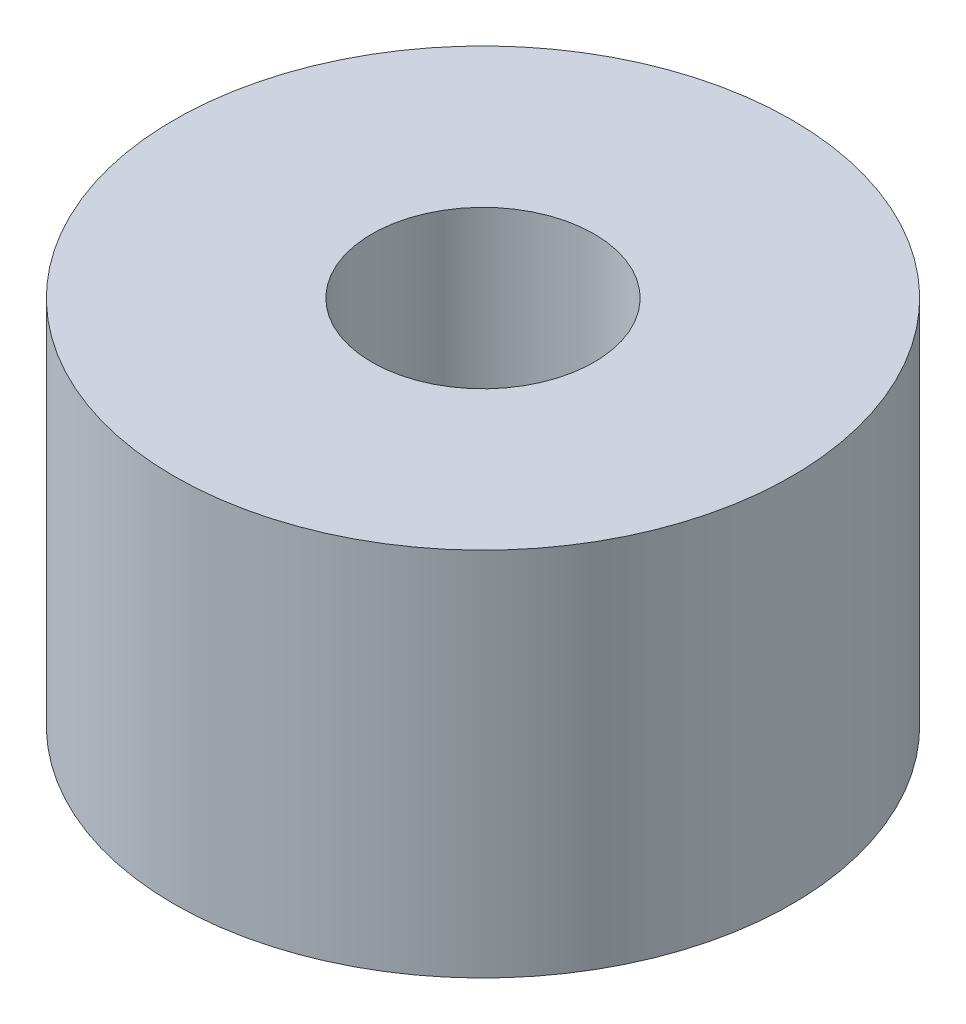
ISO-10303-21;
HEADER;
FILE_DESCRIPTION(('STEP AP214'),'2;1');
FILE_NAME('part.step','',(''),(''),'','','');
FILE_SCHEMA(('AUTOMOTIVE_DESIGN { 1 0 10303 214 1 1 1 1 }'));
ENDSEC;
DATA;
#1=APPLICATION_CONTEXT('core data for automotive mechanical design processes');
#2=APPLICATION_PROTOCOL_DEFINITION('international standard','automotive_design',2000,#1);
#3=PRODUCT_CONTEXT('',#1,'mechanical');
#4=PRODUCT('Part','Part','',(#3));
#5=PRODUCT_RELATED_PRODUCT_CATEGORY('part','',(#4));
#6=PRODUCT_DEFINITION_FORMATION('','',#4);
#7=PRODUCT_DEFINITION_CONTEXT('part definition',#1,'design');
#8=PRODUCT_DEFINITION('design','',#6,#7);
#9=PRODUCT_DEFINITION_SHAPE('','',#8);
#10=(LENGTH_UNIT() NAMED_UNIT(*) SI_UNIT(.MILLI.,.METRE.));
#11=(NAMED_UNIT(*) PLANE_ANGLE_UNIT() SI_UNIT($,.RADIAN.));
#12=(NAMED_UNIT(*) SI_UNIT($,.STERADIAN.) SOLID_ANGLE_UNIT());
#13=UNCERTAINTY_MEASURE_WITH_UNIT(LENGTH_MEASURE(1.E-05),#10,'distance_accuracy_value','');
#14=(GEOMETRIC_REPRESENTATION_CONTEXT(3) GLOBAL_UNCERTAINTY_ASSIGNED_CONTEXT((#13)) GLOBAL_UNIT_ASSIGNED_CONTEXT((#10,
#11,#12)) REPRESENTATION_CONTEXT('',''));
#15=CARTESIAN_POINT('',(0.,0.,0.));
#16=DIRECTION('',(0.,0.,1.));
#17=DIRECTION('',(1.,0.,0.));
#18=AXIS2_PLACEMENT_3D('',#15,#16,#17);
#19=CARTESIAN_POINT('',(0.,6.,0.));
#20=DIRECTION('',(0.,1.,0.));
#21=DIRECTION('',(0.,0.,1.));
#22=AXIS2_PLACEMENT_3D('',#19,#20,#21);
#23=PLANE('',#22);
#24=CARTESIAN_POINT('',(0.,6.,0.));
#25=DIRECTION('',(0.,1.,0.));
#26=DIRECTION('',(0.,0.,1.));
#27=AXIS2_PLACEMENT_3D('',#24,#25,#26);
#28=CIRCLE('',#27,5.);
#29=CARTESIAN_POINT('',(0.,6.,5.));
#30=VERTEX_POINT('',#29);
#31=EDGE_CURVE('E10',#30,#30,#28,.T.);
#32=ORIENTED_EDGE('',*,*,#31,.T.);
#33=EDGE_LOOP('',(#32));
#34=FACE_BOUND('',#33,.T.);
#35=CARTESIAN_POINT('',(0.,6.,0.));
#36=DIRECTION('',(0.,1.,0.));
#37=DIRECTION('',(0.,0.,1.));
#38=AXIS2_PLACEMENT_3D('',#35,#36,#37);
#39=CIRCLE('',#38,1.8);
#40=CARTESIAN_POINT('',(0.,6.,1.8));
#41=VERTEX_POINT('',#40);
#42=EDGE_CURVE('E52',#41,#41,#39,.T.);
#43=ORIENTED_EDGE('',*,*,#42,.F.);
#44=EDGE_LOOP('',(#43));
#45=FACE_BOUND('',#44,.T.);
#46=ADVANCED_FACE('F41',(#34,#45),#23,.T.);
#47=CARTESIAN_POINT('',(0.,0.,0.));
#48=DIRECTION('',(0.,1.,0.));
#49=DIRECTION('',(0.,0.,1.));
#50=AXIS2_PLACEMENT_3D('',#47,#48,#49);
#51=PLANE('',#50);
#52=CARTESIAN_POINT('',(0.,0.,0.));
#53=DIRECTION('',(0.,1.,0.));
#54=DIRECTION('',(0.,0.,1.));
#55=AXIS2_PLACEMENT_3D('',#52,#53,#54);
#56=CIRCLE('',#55,5.);
#57=CARTESIAN_POINT('',(0.,0.,5.));
#58=VERTEX_POINT('',#57);
#59=EDGE_CURVE('E45',#58,#58,#56,.T.);
#60=ORIENTED_EDGE('',*,*,#59,.F.);
#61=EDGE_LOOP('',(#60));
#62=FACE_BOUND('',#61,.T.);
#63=CARTESIAN_POINT('',(0.,0.,0.));
#64=DIRECTION('',(0.,1.,0.));
#65=DIRECTION('',(0.,0.,1.));
#66=AXIS2_PLACEMENT_3D('',#63,#64,#65);
#67=CIRCLE('',#66,1.8);
#68=CARTESIAN_POINT('',(0.,0.,1.8));
#69=VERTEX_POINT('',#68);
#70=EDGE_CURVE('E54',#69,#69,#67,.T.);
#71=ORIENTED_EDGE('',*,*,#70,.T.);
#72=EDGE_LOOP('',(#71));
#73=FACE_BOUND('',#72,.T.);
#74=ADVANCED_FACE('F64',(#62,#73),#51,.F.);
#75=CARTESIAN_POINT('',(0.,6.,0.));
#76=DIRECTION('',(0.,-1.,0.));
#77=DIRECTION('',(0.,0.,-1.));
#78=AXIS2_PLACEMENT_3D('',#75,#76,#77);
#79=CYLINDRICAL_SURFACE('',#78,5.);
#80=ORIENTED_EDGE('',*,*,#31,.F.);
#81=EDGE_LOOP('',(#80));
#82=FACE_BOUND('',#81,.T.);
#83=ORIENTED_EDGE('',*,*,#59,.T.);
#84=EDGE_LOOP('',(#83));
#85=FACE_BOUND('',#84,.T.);
#86=ADVANCED_FACE('F43',(#82,#85),#79,.T.);
#87=CARTESIAN_POINT('',(0.,6.,0.));
#88=DIRECTION('',(0.,-1.,0.));
#89=DIRECTION('',(0.,0.,-1.));
#90=AXIS2_PLACEMENT_3D('',#87,#88,#89);
#91=CYLINDRICAL_SURFACE('',#90,1.8);
#92=ORIENTED_EDGE('',*,*,#42,.T.);
#93=EDGE_LOOP('',(#92));
#94=FACE_BOUND('',#93,.T.);
#95=ORIENTED_EDGE('',*,*,#70,.F.);
#96=EDGE_LOOP('',(#95));
#97=FACE_BOUND('',#96,.T.);
#98=ADVANCED_FACE('F60',(#94,#97),#91,.F.);
#99=CLOSED_SHELL('',(#46,#74,#86,#98));
#100=MANIFOLD_SOLID_BREP('B2',#99);
#101=ADVANCED_BREP_SHAPE_REPRESENTATION('',(#18,#100),#14);
#102=SHAPE_DEFINITION_REPRESENTATION(#9,#101);
ENDSEC;
END-ISO-10303-21;
